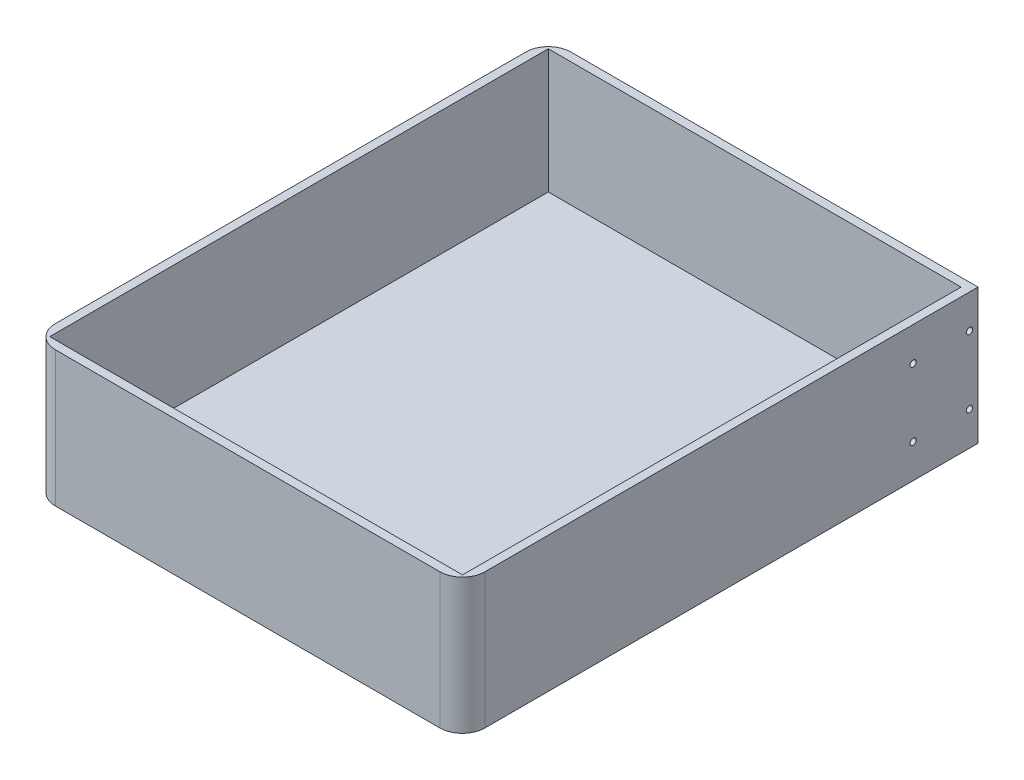
ISO-10303-21;
HEADER;
FILE_DESCRIPTION(('STEP AP214'),'2;1');
FILE_NAME('part.step','',(''),(''),'','','');
FILE_SCHEMA(('AUTOMOTIVE_DESIGN { 1 0 10303 214 1 1 1 1 }'));
ENDSEC;
DATA;
#1=APPLICATION_CONTEXT('core data for automotive mechanical design processes');
#2=APPLICATION_PROTOCOL_DEFINITION('international standard','automotive_design',2000,#1);
#3=PRODUCT_CONTEXT('',#1,'mechanical');
#4=PRODUCT('Part','Part','',(#3));
#5=PRODUCT_RELATED_PRODUCT_CATEGORY('part','',(#4));
#6=PRODUCT_DEFINITION_FORMATION('','',#4);
#7=PRODUCT_DEFINITION_CONTEXT('part definition',#1,'design');
#8=PRODUCT_DEFINITION('design','',#6,#7);
#9=PRODUCT_DEFINITION_SHAPE('','',#8);
#10=(LENGTH_UNIT() NAMED_UNIT(*) SI_UNIT(.MILLI.,.METRE.));
#11=(NAMED_UNIT(*) PLANE_ANGLE_UNIT() SI_UNIT($,.RADIAN.));
#12=(NAMED_UNIT(*) SI_UNIT($,.STERADIAN.) SOLID_ANGLE_UNIT());
#13=UNCERTAINTY_MEASURE_WITH_UNIT(LENGTH_MEASURE(1.E-05),#10,'distance_accuracy_value','');
#14=(GEOMETRIC_REPRESENTATION_CONTEXT(3) GLOBAL_UNCERTAINTY_ASSIGNED_CONTEXT((#13)) GLOBAL_UNIT_ASSIGNED_CONTEXT((#10,
#11,#12)) REPRESENTATION_CONTEXT('',''));
#15=CARTESIAN_POINT('',(0.,0.,0.));
#16=DIRECTION('',(0.,0.,1.));
#17=DIRECTION('',(1.,0.,0.));
#18=AXIS2_PLACEMENT_3D('',#15,#16,#17);
#19=CARTESIAN_POINT('',(0.,120.,0.));
#20=DIRECTION('',(0.,-1.,0.));
#21=DIRECTION('',(0.,0.,-1.));
#22=AXIS2_PLACEMENT_3D('',#19,#20,#21);
#23=PLANE('',#22);
#24=DIRECTION('',(1.,0.,0.));
#25=VECTOR('',#24,1.);
#26=CARTESIAN_POINT('',(0.,120.,0.));
#27=LINE('',#26,#25);
#28=CARTESIAN_POINT('',(20.,120.,0.));
#29=VERTEX_POINT('',#28);
#30=CARTESIAN_POINT('',(361.,120.,0.));
#31=VERTEX_POINT('',#30);
#32=EDGE_CURVE('E250',#29,#31,#27,.T.);
#33=ORIENTED_EDGE('',*,*,#32,.T.);
#34=CARTESIAN_POINT('',(361.,120.,-20.));
#35=DIRECTION('',(0.,-1.,0.));
#36=DIRECTION('',(0.,0.,-1.));
#37=AXIS2_PLACEMENT_3D('',#34,#35,#36);
#38=CIRCLE('',#37,20.);
#39=CARTESIAN_POINT('',(381.,120.,-20.));
#40=VERTEX_POINT('',#39);
#41=EDGE_CURVE('E305',#31,#40,#38,.F.);
#42=ORIENTED_EDGE('',*,*,#41,.T.);
#43=DIRECTION('',(0.,0.,-1.));
#44=VECTOR('',#43,1.);
#45=CARTESIAN_POINT('',(381.,120.,0.));
#46=LINE('',#45,#44);
#47=CARTESIAN_POINT('',(381.,120.,-457.2));
#48=VERTEX_POINT('',#47);
#49=EDGE_CURVE('E255',#40,#48,#46,.T.);
#50=ORIENTED_EDGE('',*,*,#49,.T.);
#51=DIRECTION('',(-1.,0.,0.));
#52=VECTOR('',#51,1.);
#53=CARTESIAN_POINT('',(0.,120.,-457.2));
#54=LINE('',#53,#52);
#55=CARTESIAN_POINT('',(20.,120.,-457.2));
#56=VERTEX_POINT('',#55);
#57=EDGE_CURVE('E258',#48,#56,#54,.T.);
#58=ORIENTED_EDGE('',*,*,#57,.T.);
#59=CARTESIAN_POINT('',(20.,120.,-437.2));
#60=DIRECTION('',(0.,-1.,0.));
#61=DIRECTION('',(0.,0.,-1.));
#62=AXIS2_PLACEMENT_3D('',#59,#60,#61);
#63=CIRCLE('',#62,20.);
#64=CARTESIAN_POINT('',(0.,120.,-437.2));
#65=VERTEX_POINT('',#64);
#66=EDGE_CURVE('E299',#56,#65,#63,.F.);
#67=ORIENTED_EDGE('',*,*,#66,.T.);
#68=DIRECTION('',(0.,0.,1.));
#69=VECTOR('',#68,1.);
#70=CARTESIAN_POINT('',(0.,120.,0.));
#71=LINE('',#70,#69);
#72=CARTESIAN_POINT('',(0.,120.,-20.));
#73=VERTEX_POINT('',#72);
#74=EDGE_CURVE('E246',#65,#73,#71,.T.);
#75=ORIENTED_EDGE('',*,*,#74,.T.);
#76=CARTESIAN_POINT('',(20.,120.,-20.));
#77=DIRECTION('',(0.,-1.,0.));
#78=DIRECTION('',(0.,0.,-1.));
#79=AXIS2_PLACEMENT_3D('',#76,#77,#78);
#80=CIRCLE('',#79,20.);
#81=EDGE_CURVE('E302',#73,#29,#80,.F.);
#82=ORIENTED_EDGE('',*,*,#81,.T.);
#83=EDGE_LOOP('',(#33,#42,#50,#58,#67,#75,#82));
#84=FACE_BOUND('',#83,.T.);
#85=DIRECTION('',(0.,0.,1.));
#86=VECTOR('',#85,1.);
#87=CARTESIAN_POINT('',(7.5,120.,-7.6));
#88=LINE('',#87,#86);
#89=CARTESIAN_POINT('',(7.5,120.,-449.7));
#90=VERTEX_POINT('',#89);
#91=CARTESIAN_POINT('',(7.5,120.,-7.6));
#92=VERTEX_POINT('',#91);
#93=EDGE_CURVE('E216',#90,#92,#88,.T.);
#94=ORIENTED_EDGE('',*,*,#93,.F.);
#95=DIRECTION('',(-1.,0.,0.));
#96=VECTOR('',#95,1.);
#97=CARTESIAN_POINT('',(7.5,120.,-449.7));
#98=LINE('',#97,#96);
#99=CARTESIAN_POINT('',(373.5,120.,-449.7));
#100=VERTEX_POINT('',#99);
#101=EDGE_CURVE('E226',#100,#90,#98,.T.);
#102=ORIENTED_EDGE('',*,*,#101,.F.);
#103=DIRECTION('',(0.,0.,-1.));
#104=VECTOR('',#103,1.);
#105=CARTESIAN_POINT('',(373.5,120.,-7.6));
#106=LINE('',#105,#104);
#107=CARTESIAN_POINT('',(373.5,120.,-7.6));
#108=VERTEX_POINT('',#107);
#109=EDGE_CURVE('E222',#108,#100,#106,.T.);
#110=ORIENTED_EDGE('',*,*,#109,.F.);
#111=DIRECTION('',(1.,0.,0.));
#112=VECTOR('',#111,1.);
#113=CARTESIAN_POINT('',(7.5,120.,-7.6));
#114=LINE('',#113,#112);
#115=EDGE_CURVE('E219',#92,#108,#114,.T.);
#116=ORIENTED_EDGE('',*,*,#115,.F.);
#117=EDGE_LOOP('',(#94,#102,#110,#116));
#118=FACE_BOUND('',#117,.T.);
#119=ADVANCED_FACE('F44',(#84,#118),#23,.F.);
#120=CARTESIAN_POINT('',(0.,0.,0.));
#121=DIRECTION('',(0.,-1.,0.));
#122=DIRECTION('',(0.,0.,-1.));
#123=AXIS2_PLACEMENT_3D('',#120,#121,#122);
#124=PLANE('',#123);
#125=DIRECTION('',(0.,0.,-1.));
#126=VECTOR('',#125,1.);
#127=CARTESIAN_POINT('',(381.,0.,0.));
#128=LINE('',#127,#126);
#129=CARTESIAN_POINT('',(381.,0.,-20.));
#130=VERTEX_POINT('',#129);
#131=CARTESIAN_POINT('',(381.,0.,-457.2));
#132=VERTEX_POINT('',#131);
#133=EDGE_CURVE('E270',#130,#132,#128,.T.);
#134=ORIENTED_EDGE('',*,*,#133,.F.);
#135=CARTESIAN_POINT('',(361.,0.,-20.));
#136=DIRECTION('',(0.,-1.,0.));
#137=DIRECTION('',(0.,0.,-1.));
#138=AXIS2_PLACEMENT_3D('',#135,#136,#137);
#139=CIRCLE('',#138,20.);
#140=CARTESIAN_POINT('',(361.,0.,0.));
#141=VERTEX_POINT('',#140);
#142=EDGE_CURVE('E289',#130,#141,#139,.T.);
#143=ORIENTED_EDGE('',*,*,#142,.T.);
#144=DIRECTION('',(1.,0.,0.));
#145=VECTOR('',#144,1.);
#146=CARTESIAN_POINT('',(0.,0.,0.));
#147=LINE('',#146,#145);
#148=CARTESIAN_POINT('',(20.,0.,0.));
#149=VERTEX_POINT('',#148);
#150=EDGE_CURVE('E266',#149,#141,#147,.T.);
#151=ORIENTED_EDGE('',*,*,#150,.F.);
#152=CARTESIAN_POINT('',(20.,0.,-20.));
#153=DIRECTION('',(0.,-1.,0.));
#154=DIRECTION('',(0.,0.,-1.));
#155=AXIS2_PLACEMENT_3D('',#152,#153,#154);
#156=CIRCLE('',#155,20.);
#157=CARTESIAN_POINT('',(0.,0.,-20.));
#158=VERTEX_POINT('',#157);
#159=EDGE_CURVE('E286',#149,#158,#156,.T.);
#160=ORIENTED_EDGE('',*,*,#159,.T.);
#161=DIRECTION('',(0.,0.,1.));
#162=VECTOR('',#161,1.);
#163=CARTESIAN_POINT('',(0.,0.,0.));
#164=LINE('',#163,#162);
#165=CARTESIAN_POINT('',(0.,0.,-437.2));
#166=VERTEX_POINT('',#165);
#167=EDGE_CURVE('E245',#166,#158,#164,.T.);
#168=ORIENTED_EDGE('',*,*,#167,.F.);
#169=CARTESIAN_POINT('',(20.,0.,-437.2));
#170=DIRECTION('',(0.,-1.,0.));
#171=DIRECTION('',(0.,0.,-1.));
#172=AXIS2_PLACEMENT_3D('',#169,#170,#171);
#173=CIRCLE('',#172,20.);
#174=CARTESIAN_POINT('',(20.,0.,-457.2));
#175=VERTEX_POINT('',#174);
#176=EDGE_CURVE('E283',#166,#175,#173,.T.);
#177=ORIENTED_EDGE('',*,*,#176,.T.);
#178=DIRECTION('',(-1.,0.,0.));
#179=VECTOR('',#178,1.);
#180=CARTESIAN_POINT('',(0.,0.,-457.2));
#181=LINE('',#180,#179);
#182=EDGE_CURVE('E251',#132,#175,#181,.T.);
#183=ORIENTED_EDGE('',*,*,#182,.F.);
#184=EDGE_LOOP('',(#134,#143,#151,#160,#168,#177,#183));
#185=FACE_BOUND('',#184,.T.);
#186=ADVANCED_FACE('F335',(#185),#124,.T.);
#187=CARTESIAN_POINT('',(0.,120.,0.));
#188=DIRECTION('',(1.,0.,0.));
#189=DIRECTION('',(0.,0.,-1.));
#190=AXIS2_PLACEMENT_3D('',#187,#188,#189);
#191=PLANE('',#190);
#192=ORIENTED_EDGE('',*,*,#167,.T.);
#193=DIRECTION('',(0.,-1.,0.));
#194=VECTOR('',#193,1.);
#195=CARTESIAN_POINT('',(0.,120.,-20.));
#196=LINE('',#195,#194);
#197=EDGE_CURVE('E312',#158,#73,#196,.F.);
#198=ORIENTED_EDGE('',*,*,#197,.T.);
#199=ORIENTED_EDGE('',*,*,#74,.F.);
#200=DIRECTION('',(0.,-1.,0.));
#201=VECTOR('',#200,1.);
#202=CARTESIAN_POINT('',(0.,120.,-437.2));
#203=LINE('',#202,#201);
#204=EDGE_CURVE('E308',#65,#166,#203,.T.);
#205=ORIENTED_EDGE('',*,*,#204,.T.);
#206=EDGE_LOOP('',(#192,#198,#199,#205));
#207=FACE_BOUND('',#206,.T.);
#208=ADVANCED_FACE('F331',(#207),#191,.F.);
#209=CARTESIAN_POINT('',(0.,120.,0.));
#210=DIRECTION('',(0.,0.,-1.));
#211=DIRECTION('',(-1.,0.,0.));
#212=AXIS2_PLACEMENT_3D('',#209,#210,#211);
#213=PLANE('',#212);
#214=ORIENTED_EDGE('',*,*,#150,.T.);
#215=DIRECTION('',(0.,-1.,0.));
#216=VECTOR('',#215,1.);
#217=CARTESIAN_POINT('',(361.,120.,0.));
#218=LINE('',#217,#216);
#219=EDGE_CURVE('E296',#141,#31,#218,.F.);
#220=ORIENTED_EDGE('',*,*,#219,.T.);
#221=ORIENTED_EDGE('',*,*,#32,.F.);
#222=DIRECTION('',(0.,-1.,0.));
#223=VECTOR('',#222,1.);
#224=CARTESIAN_POINT('',(20.,120.,0.));
#225=LINE('',#224,#223);
#226=EDGE_CURVE('E292',#29,#149,#225,.T.);
#227=ORIENTED_EDGE('',*,*,#226,.T.);
#228=EDGE_LOOP('',(#214,#220,#221,#227));
#229=FACE_BOUND('',#228,.T.);
#230=ADVANCED_FACE('F343',(#229),#213,.F.);
#231=CARTESIAN_POINT('',(381.,120.,0.));
#232=DIRECTION('',(-1.,0.,0.));
#233=DIRECTION('',(0.,0.,1.));
#234=AXIS2_PLACEMENT_3D('',#231,#232,#233);
#235=PLANE('',#234);
#236=CARTESIAN_POINT('',(381.,30.,-399.7));
#237=DIRECTION('',(1.,0.,0.));
#238=DIRECTION('',(0.,0.,-1.));
#239=AXIS2_PLACEMENT_3D('',#236,#237,#238);
#240=CIRCLE('',#239,2.74999999999998);
#241=CARTESIAN_POINT('',(381.,30.,-402.45));
#242=VERTEX_POINT('',#241);
#243=EDGE_CURVE('E539',#242,#242,#240,.T.);
#244=ORIENTED_EDGE('',*,*,#243,.F.);
#245=EDGE_LOOP('',(#244));
#246=FACE_BOUND('',#245,.T.);
#247=CARTESIAN_POINT('',(381.,30.,-449.7));
#248=DIRECTION('',(1.,0.,0.));
#249=DIRECTION('',(0.,0.,-1.));
#250=AXIS2_PLACEMENT_3D('',#247,#248,#249);
#251=CIRCLE('',#250,2.74999999999998);
#252=CARTESIAN_POINT('',(381.,30.,-452.45));
#253=VERTEX_POINT('',#252);
#254=EDGE_CURVE('E537',#253,#253,#251,.T.);
#255=ORIENTED_EDGE('',*,*,#254,.F.);
#256=EDGE_LOOP('',(#255));
#257=FACE_BOUND('',#256,.T.);
#258=CARTESIAN_POINT('',(381.,90.,-449.7));
#259=DIRECTION('',(1.,0.,0.));
#260=DIRECTION('',(0.,0.,-1.));
#261=AXIS2_PLACEMENT_3D('',#258,#259,#260);
#262=CIRCLE('',#261,2.74999999999998);
#263=CARTESIAN_POINT('',(381.,90.,-452.45));
#264=VERTEX_POINT('',#263);
#265=EDGE_CURVE('E167',#264,#264,#262,.T.);
#266=ORIENTED_EDGE('',*,*,#265,.F.);
#267=EDGE_LOOP('',(#266));
#268=FACE_BOUND('',#267,.T.);
#269=CARTESIAN_POINT('',(381.,90.,-399.7));
#270=DIRECTION('',(1.,0.,0.));
#271=DIRECTION('',(0.,0.,-1.));
#272=AXIS2_PLACEMENT_3D('',#269,#270,#271);
#273=CIRCLE('',#272,2.74999999999998);
#274=CARTESIAN_POINT('',(381.,90.,-402.45));
#275=VERTEX_POINT('',#274);
#276=EDGE_CURVE('E166',#275,#275,#273,.T.);
#277=ORIENTED_EDGE('',*,*,#276,.F.);
#278=EDGE_LOOP('',(#277));
#279=FACE_BOUND('',#278,.T.);
#280=ORIENTED_EDGE('',*,*,#49,.F.);
#281=DIRECTION('',(0.,-1.,0.));
#282=VECTOR('',#281,1.);
#283=CARTESIAN_POINT('',(381.,120.,-20.));
#284=LINE('',#283,#282);
#285=EDGE_CURVE('E279',#40,#130,#284,.T.);
#286=ORIENTED_EDGE('',*,*,#285,.T.);
#287=ORIENTED_EDGE('',*,*,#133,.T.);
#288=DIRECTION('',(0.,-1.,0.));
#289=VECTOR('',#288,1.);
#290=CARTESIAN_POINT('',(381.,120.,-457.2));
#291=LINE('',#290,#289);
#292=EDGE_CURVE('E262',#48,#132,#291,.T.);
#293=ORIENTED_EDGE('',*,*,#292,.F.);
#294=EDGE_LOOP('',(#280,#286,#287,#293));
#295=FACE_BOUND('',#294,.T.);
#296=ADVANCED_FACE('F350',(#246,#257,#268,#279,#295),#235,.F.);
#297=CARTESIAN_POINT('',(0.,120.,-457.2));
#298=DIRECTION('',(0.,0.,1.));
#299=DIRECTION('',(1.,0.,0.));
#300=AXIS2_PLACEMENT_3D('',#297,#298,#299);
#301=PLANE('',#300);
#302=ORIENTED_EDGE('',*,*,#182,.T.);
#303=DIRECTION('',(0.,-1.,0.));
#304=VECTOR('',#303,1.);
#305=CARTESIAN_POINT('',(20.,120.,-457.2));
#306=LINE('',#305,#304);
#307=EDGE_CURVE('E158',#175,#56,#306,.F.);
#308=ORIENTED_EDGE('',*,*,#307,.T.);
#309=ORIENTED_EDGE('',*,*,#57,.F.);
#310=ORIENTED_EDGE('',*,*,#292,.T.);
#311=EDGE_LOOP('',(#302,#308,#309,#310));
#312=FACE_BOUND('',#311,.T.);
#313=ADVANCED_FACE('F319',(#312),#301,.F.);
#314=CARTESIAN_POINT('',(7.5,120.,-7.6));
#315=DIRECTION('',(1.,0.,0.));
#316=DIRECTION('',(0.,0.,-1.));
#317=AXIS2_PLACEMENT_3D('',#314,#315,#316);
#318=PLANE('',#317);
#319=DIRECTION('',(0.,0.,-1.));
#320=VECTOR('',#319,1.);
#321=CARTESIAN_POINT('',(7.5,10.,-449.7));
#322=LINE('',#321,#320);
#323=CARTESIAN_POINT('',(7.5,9.99999999999999,-7.6));
#324=VERTEX_POINT('',#323);
#325=CARTESIAN_POINT('',(7.5,10.,-449.7));
#326=VERTEX_POINT('',#325);
#327=EDGE_CURVE('E194',#324,#326,#322,.T.);
#328=ORIENTED_EDGE('',*,*,#327,.T.);
#329=DIRECTION('',(0.,-1.,0.));
#330=VECTOR('',#329,1.);
#331=CARTESIAN_POINT('',(7.5,120.,-449.7));
#332=LINE('',#331,#330);
#333=EDGE_CURVE('E229',#90,#326,#332,.T.);
#334=ORIENTED_EDGE('',*,*,#333,.F.);
#335=ORIENTED_EDGE('',*,*,#93,.T.);
#336=DIRECTION('',(0.,-1.,0.));
#337=VECTOR('',#336,1.);
#338=CARTESIAN_POINT('',(7.5,120.,-7.6));
#339=LINE('',#338,#337);
#340=EDGE_CURVE('E241',#92,#324,#339,.T.);
#341=ORIENTED_EDGE('',*,*,#340,.T.);
#342=EDGE_LOOP('',(#328,#334,#335,#341));
#343=FACE_BOUND('',#342,.T.);
#344=ADVANCED_FACE('F359',(#343),#318,.T.);
#345=CARTESIAN_POINT('',(7.5,120.,-7.6));
#346=DIRECTION('',(0.,0.,-1.));
#347=DIRECTION('',(-1.,0.,0.));
#348=AXIS2_PLACEMENT_3D('',#345,#346,#347);
#349=PLANE('',#348);
#350=DIRECTION('',(-1.,0.,0.));
#351=VECTOR('',#350,1.);
#352=CARTESIAN_POINT('',(7.5,10.,-7.6));
#353=LINE('',#352,#351);
#354=CARTESIAN_POINT('',(373.5,9.99999999999999,-7.6));
#355=VERTEX_POINT('',#354);
#356=EDGE_CURVE('E213',#355,#324,#353,.T.);
#357=ORIENTED_EDGE('',*,*,#356,.T.);
#358=ORIENTED_EDGE('',*,*,#340,.F.);
#359=ORIENTED_EDGE('',*,*,#115,.T.);
#360=DIRECTION('',(0.,-1.,0.));
#361=VECTOR('',#360,1.);
#362=CARTESIAN_POINT('',(373.5,120.,-7.6));
#363=LINE('',#362,#361);
#364=EDGE_CURVE('E237',#108,#355,#363,.T.);
#365=ORIENTED_EDGE('',*,*,#364,.T.);
#366=EDGE_LOOP('',(#357,#358,#359,#365));
#367=FACE_BOUND('',#366,.T.);
#368=ADVANCED_FACE('F375',(#367),#349,.T.);
#369=CARTESIAN_POINT('',(373.5,120.,-7.6));
#370=DIRECTION('',(-1.,0.,0.));
#371=DIRECTION('',(0.,0.,1.));
#372=AXIS2_PLACEMENT_3D('',#369,#370,#371);
#373=PLANE('',#372);
#374=CARTESIAN_POINT('',(373.5,30.,-399.7));
#375=DIRECTION('',(-1.,0.,0.));
#376=DIRECTION('',(0.,0.,1.));
#377=AXIS2_PLACEMENT_3D('',#374,#375,#376);
#378=CIRCLE('',#377,2.74999999999998);
#379=CARTESIAN_POINT('',(373.5,30.,-396.95));
#380=VERTEX_POINT('',#379);
#381=EDGE_CURVE('E48',#380,#380,#378,.T.);
#382=ORIENTED_EDGE('',*,*,#381,.F.);
#383=EDGE_LOOP('',(#382));
#384=FACE_BOUND('',#383,.T.);
#385=CARTESIAN_POINT('',(373.5,30.,-449.7));
#386=DIRECTION('',(-1.,0.,0.));
#387=DIRECTION('',(0.,0.,1.));
#388=AXIS2_PLACEMENT_3D('',#385,#386,#387);
#389=CIRCLE('',#388,2.74999999999998);
#390=CARTESIAN_POINT('',(373.5,27.25,-449.7));
#391=VERTEX_POINT('',#390);
#392=CARTESIAN_POINT('',(373.5,32.75,-449.7));
#393=VERTEX_POINT('',#392);
#394=EDGE_CURVE('E188',#391,#393,#389,.T.);
#395=ORIENTED_EDGE('',*,*,#394,.F.);
#396=DIRECTION('',(0.,-1.,0.));
#397=VECTOR('',#396,1.);
#398=CARTESIAN_POINT('',(373.5,120.,-449.7));
#399=LINE('',#398,#397);
#400=CARTESIAN_POINT('',(373.5,9.99999999999999,-449.7));
#401=VERTEX_POINT('',#400);
#402=EDGE_CURVE('E232',#391,#401,#399,.T.);
#403=ORIENTED_EDGE('',*,*,#402,.T.);
#404=DIRECTION('',(0.,0.,1.));
#405=VECTOR('',#404,1.);
#406=CARTESIAN_POINT('',(373.5,10.,-449.7));
#407=LINE('',#406,#405);
#408=EDGE_CURVE('E210',#401,#355,#407,.T.);
#409=ORIENTED_EDGE('',*,*,#408,.T.);
#410=ORIENTED_EDGE('',*,*,#364,.F.);
#411=ORIENTED_EDGE('',*,*,#109,.T.);
#412=CARTESIAN_POINT('',(373.5,92.75,-449.7));
#413=VERTEX_POINT('',#412);
#414=EDGE_CURVE('E233',#100,#413,#399,.T.);
#415=ORIENTED_EDGE('',*,*,#414,.T.);
#416=CARTESIAN_POINT('',(373.5,90.,-449.7));
#417=DIRECTION('',(-1.,0.,0.));
#418=DIRECTION('',(0.,0.,1.));
#419=AXIS2_PLACEMENT_3D('',#416,#417,#418);
#420=CIRCLE('',#419,2.74999999999998);
#421=CARTESIAN_POINT('',(373.5,87.25,-449.7));
#422=VERTEX_POINT('',#421);
#423=EDGE_CURVE('E195',#422,#413,#420,.T.);
#424=ORIENTED_EDGE('',*,*,#423,.F.);
#425=EDGE_CURVE('E174',#422,#393,#399,.T.);
#426=ORIENTED_EDGE('',*,*,#425,.T.);
#427=EDGE_LOOP('',(#395,#403,#409,#410,#411,#415,#424,#426));
#428=FACE_BOUND('',#427,.T.);
#429=CARTESIAN_POINT('',(373.5,90.,-399.7));
#430=DIRECTION('',(-1.,0.,0.));
#431=DIRECTION('',(0.,0.,1.));
#432=AXIS2_PLACEMENT_3D('',#429,#430,#431);
#433=CIRCLE('',#432,2.74999999999998);
#434=CARTESIAN_POINT('',(373.5,90.,-396.95));
#435=VERTEX_POINT('',#434);
#436=EDGE_CURVE('E185',#435,#435,#433,.T.);
#437=ORIENTED_EDGE('',*,*,#436,.F.);
#438=EDGE_LOOP('',(#437));
#439=FACE_BOUND('',#438,.T.);
#440=ADVANCED_FACE('F379',(#384,#428,#439),#373,.T.);
#441=CARTESIAN_POINT('',(7.5,120.,-449.7));
#442=DIRECTION('',(0.,0.,1.));
#443=DIRECTION('',(1.,0.,0.));
#444=AXIS2_PLACEMENT_3D('',#441,#442,#443);
#445=PLANE('',#444);
#446=DIRECTION('',(1.,0.,0.));
#447=VECTOR('',#446,1.);
#448=CARTESIAN_POINT('',(371.,27.25,-449.7));
#449=LINE('',#448,#447);
#450=CARTESIAN_POINT('',(371.,27.25,-449.7));
#451=VERTEX_POINT('',#450);
#452=EDGE_CURVE('E11',#451,#391,#449,.T.);
#453=ORIENTED_EDGE('',*,*,#452,.F.);
#454=DIRECTION('',(0.,1.,0.));
#455=VECTOR('',#454,1.);
#456=CARTESIAN_POINT('',(371.,120.,-449.7));
#457=LINE('',#456,#455);
#458=CARTESIAN_POINT('',(371.,32.75,-449.7));
#459=VERTEX_POINT('',#458);
#460=EDGE_CURVE('E176',#451,#459,#457,.T.);
#461=ORIENTED_EDGE('',*,*,#460,.T.);
#462=DIRECTION('',(1.,0.,0.));
#463=VECTOR('',#462,1.);
#464=CARTESIAN_POINT('',(371.,32.75,-449.7));
#465=LINE('',#464,#463);
#466=EDGE_CURVE('E54',#393,#459,#465,.F.);
#467=ORIENTED_EDGE('',*,*,#466,.F.);
#468=ORIENTED_EDGE('',*,*,#425,.F.);
#469=DIRECTION('',(1.,0.,0.));
#470=VECTOR('',#469,1.);
#471=CARTESIAN_POINT('',(371.,87.25,-449.7));
#472=LINE('',#471,#470);
#473=CARTESIAN_POINT('',(371.,87.25,-449.7));
#474=VERTEX_POINT('',#473);
#475=EDGE_CURVE('E163',#474,#422,#472,.T.);
#476=ORIENTED_EDGE('',*,*,#475,.F.);
#477=DIRECTION('',(0.,1.,0.));
#478=VECTOR('',#477,1.);
#479=CARTESIAN_POINT('',(371.,120.,-449.7));
#480=LINE('',#479,#478);
#481=CARTESIAN_POINT('',(371.,92.75,-449.7));
#482=VERTEX_POINT('',#481);
#483=EDGE_CURVE('E151',#474,#482,#480,.T.);
#484=ORIENTED_EDGE('',*,*,#483,.T.);
#485=DIRECTION('',(1.,0.,0.));
#486=VECTOR('',#485,1.);
#487=CARTESIAN_POINT('',(371.,92.75,-449.7));
#488=LINE('',#487,#486);
#489=EDGE_CURVE('E157',#413,#482,#488,.F.);
#490=ORIENTED_EDGE('',*,*,#489,.F.);
#491=ORIENTED_EDGE('',*,*,#414,.F.);
#492=ORIENTED_EDGE('',*,*,#101,.T.);
#493=ORIENTED_EDGE('',*,*,#333,.T.);
#494=DIRECTION('',(1.,0.,0.));
#495=VECTOR('',#494,1.);
#496=CARTESIAN_POINT('',(7.5,10.,-449.7));
#497=LINE('',#496,#495);
#498=EDGE_CURVE('E206',#326,#401,#497,.T.);
#499=ORIENTED_EDGE('',*,*,#498,.T.);
#500=ORIENTED_EDGE('',*,*,#402,.F.);
#501=EDGE_LOOP('',(#453,#461,#467,#468,#476,#484,#490,#491,#492,#493,#499,#500));
#502=FACE_BOUND('',#501,.T.);
#503=ADVANCED_FACE('F171',(#502),#445,.T.);
#504=CARTESIAN_POINT('',(0.,10.,0.));
#505=DIRECTION('',(0.,1.,0.));
#506=DIRECTION('',(0.,0.,1.));
#507=AXIS2_PLACEMENT_3D('',#504,#505,#506);
#508=PLANE('',#507);
#509=ORIENTED_EDGE('',*,*,#327,.F.);
#510=ORIENTED_EDGE('',*,*,#356,.F.);
#511=ORIENTED_EDGE('',*,*,#408,.F.);
#512=ORIENTED_EDGE('',*,*,#498,.F.);
#513=EDGE_LOOP('',(#509,#510,#511,#512));
#514=FACE_BOUND('',#513,.T.);
#515=ADVANCED_FACE('F385',(#514),#508,.T.);
#516=CARTESIAN_POINT('',(361.,120.,-20.));
#517=DIRECTION('',(0.,-1.,0.));
#518=DIRECTION('',(0.,0.,-1.));
#519=AXIS2_PLACEMENT_3D('',#516,#517,#518);
#520=CYLINDRICAL_SURFACE('',#519,20.);
#521=ORIENTED_EDGE('',*,*,#41,.F.);
#522=ORIENTED_EDGE('',*,*,#219,.F.);
#523=ORIENTED_EDGE('',*,*,#142,.F.);
#524=ORIENTED_EDGE('',*,*,#285,.F.);
#525=EDGE_LOOP('',(#521,#522,#523,#524));
#526=FACE_BOUND('',#525,.T.);
#527=ADVANCED_FACE('F348',(#526),#520,.T.);
#528=CARTESIAN_POINT('',(20.,120.,-20.));
#529=DIRECTION('',(0.,-1.,0.));
#530=DIRECTION('',(0.,0.,-1.));
#531=AXIS2_PLACEMENT_3D('',#528,#529,#530);
#532=CYLINDRICAL_SURFACE('',#531,20.);
#533=ORIENTED_EDGE('',*,*,#81,.F.);
#534=ORIENTED_EDGE('',*,*,#197,.F.);
#535=ORIENTED_EDGE('',*,*,#159,.F.);
#536=ORIENTED_EDGE('',*,*,#226,.F.);
#537=EDGE_LOOP('',(#533,#534,#535,#536));
#538=FACE_BOUND('',#537,.T.);
#539=ADVANCED_FACE('F340',(#538),#532,.T.);
#540=CARTESIAN_POINT('',(20.,120.,-437.2));
#541=DIRECTION('',(0.,-1.,0.));
#542=DIRECTION('',(0.,0.,-1.));
#543=AXIS2_PLACEMENT_3D('',#540,#541,#542);
#544=CYLINDRICAL_SURFACE('',#543,20.);
#545=ORIENTED_EDGE('',*,*,#66,.F.);
#546=ORIENTED_EDGE('',*,*,#307,.F.);
#547=ORIENTED_EDGE('',*,*,#176,.F.);
#548=ORIENTED_EDGE('',*,*,#204,.F.);
#549=EDGE_LOOP('',(#545,#546,#547,#548));
#550=FACE_BOUND('',#549,.T.);
#551=ADVANCED_FACE('F46',(#550),#544,.T.);
#552=CARTESIAN_POINT('',(371.,90.,-449.7));
#553=DIRECTION('',(1.,0.,0.));
#554=DIRECTION('',(0.,0.,-1.));
#555=AXIS2_PLACEMENT_3D('',#552,#553,#554);
#556=CYLINDRICAL_SURFACE('',#555,2.74999999999998);
#557=ORIENTED_EDGE('',*,*,#475,.T.);
#558=ORIENTED_EDGE('',*,*,#423,.T.);
#559=ORIENTED_EDGE('',*,*,#489,.T.);
#560=CARTESIAN_POINT('',(371.,90.,-449.7));
#561=DIRECTION('',(1.,0.,0.));
#562=DIRECTION('',(0.,0.,-1.));
#563=AXIS2_PLACEMENT_3D('',#560,#561,#562);
#564=CIRCLE('',#563,2.74999999999998);
#565=EDGE_CURVE('E68',#474,#482,#564,.T.);
#566=ORIENTED_EDGE('',*,*,#565,.F.);
#567=EDGE_LOOP('',(#557,#558,#559,#566));
#568=FACE_BOUND('',#567,.T.);
#569=ORIENTED_EDGE('',*,*,#265,.T.);
#570=EDGE_LOOP('',(#569));
#571=FACE_BOUND('',#570,.T.);
#572=ADVANCED_FACE('F161',(#568,#571),#556,.F.);
#573=CARTESIAN_POINT('',(371.,0.,0.));
#574=DIRECTION('',(1.,0.,0.));
#575=DIRECTION('',(0.,0.,-1.));
#576=AXIS2_PLACEMENT_3D('',#573,#574,#575);
#577=PLANE('',#576);
#578=ORIENTED_EDGE('',*,*,#565,.T.);
#579=ORIENTED_EDGE('',*,*,#483,.F.);
#580=EDGE_LOOP('',(#578,#579));
#581=FACE_BOUND('',#580,.T.);
#582=ADVANCED_FACE('F152',(#581),#577,.T.);
#583=CARTESIAN_POINT('',(371.,30.,-449.7));
#584=DIRECTION('',(1.,0.,0.));
#585=DIRECTION('',(0.,0.,-1.));
#586=AXIS2_PLACEMENT_3D('',#583,#584,#585);
#587=CYLINDRICAL_SURFACE('',#586,2.74999999999998);
#588=ORIENTED_EDGE('',*,*,#452,.T.);
#589=ORIENTED_EDGE('',*,*,#394,.T.);
#590=ORIENTED_EDGE('',*,*,#466,.T.);
#591=CARTESIAN_POINT('',(371.,30.,-449.7));
#592=DIRECTION('',(1.,0.,0.));
#593=DIRECTION('',(0.,0.,-1.));
#594=AXIS2_PLACEMENT_3D('',#591,#592,#593);
#595=CIRCLE('',#594,2.74999999999998);
#596=EDGE_CURVE('E61',#451,#459,#595,.T.);
#597=ORIENTED_EDGE('',*,*,#596,.F.);
#598=EDGE_LOOP('',(#588,#589,#590,#597));
#599=FACE_BOUND('',#598,.T.);
#600=ORIENTED_EDGE('',*,*,#254,.T.);
#601=EDGE_LOOP('',(#600));
#602=FACE_BOUND('',#601,.T.);
#603=ADVANCED_FACE('F396',(#599,#602),#587,.F.);
#604=CARTESIAN_POINT('',(371.,0.,0.));
#605=DIRECTION('',(1.,0.,0.));
#606=DIRECTION('',(0.,0.,-1.));
#607=AXIS2_PLACEMENT_3D('',#604,#605,#606);
#608=PLANE('',#607);
#609=ORIENTED_EDGE('',*,*,#596,.T.);
#610=ORIENTED_EDGE('',*,*,#460,.F.);
#611=EDGE_LOOP('',(#609,#610));
#612=FACE_BOUND('',#611,.T.);
#613=ADVANCED_FACE('F392',(#612),#608,.T.);
#614=CARTESIAN_POINT('',(371.,90.,-399.7));
#615=DIRECTION('',(1.,0.,0.));
#616=DIRECTION('',(0.,0.,-1.));
#617=AXIS2_PLACEMENT_3D('',#614,#615,#616);
#618=CYLINDRICAL_SURFACE('',#617,2.74999999999998);
#619=ORIENTED_EDGE('',*,*,#436,.T.);
#620=EDGE_LOOP('',(#619));
#621=FACE_BOUND('',#620,.T.);
#622=ORIENTED_EDGE('',*,*,#276,.T.);
#623=EDGE_LOOP('',(#622));
#624=FACE_BOUND('',#623,.T.);
#625=ADVANCED_FACE('F388',(#621,#624),#618,.F.);
#626=CARTESIAN_POINT('',(371.,30.,-399.7));
#627=DIRECTION('',(1.,0.,0.));
#628=DIRECTION('',(0.,0.,-1.));
#629=AXIS2_PLACEMENT_3D('',#626,#627,#628);
#630=CYLINDRICAL_SURFACE('',#629,2.74999999999998);
#631=ORIENTED_EDGE('',*,*,#381,.T.);
#632=EDGE_LOOP('',(#631));
#633=FACE_BOUND('',#632,.T.);
#634=ORIENTED_EDGE('',*,*,#243,.T.);
#635=EDGE_LOOP('',(#634));
#636=FACE_BOUND('',#635,.T.);
#637=ADVANCED_FACE('F391',(#633,#636),#630,.F.);
#638=CLOSED_SHELL('',(#119,#186,#208,#230,#296,#313,#344,#368,#440,#503,#515,#527,#539,#551,
#572,#582,#603,#613,#625,#637));
#639=MANIFOLD_SOLID_BREP('B2',#638);
#640=ADVANCED_BREP_SHAPE_REPRESENTATION('',(#18,#639),#14);
#641=SHAPE_DEFINITION_REPRESENTATION(#9,#640);
ENDSEC;
END-ISO-10303-21;
